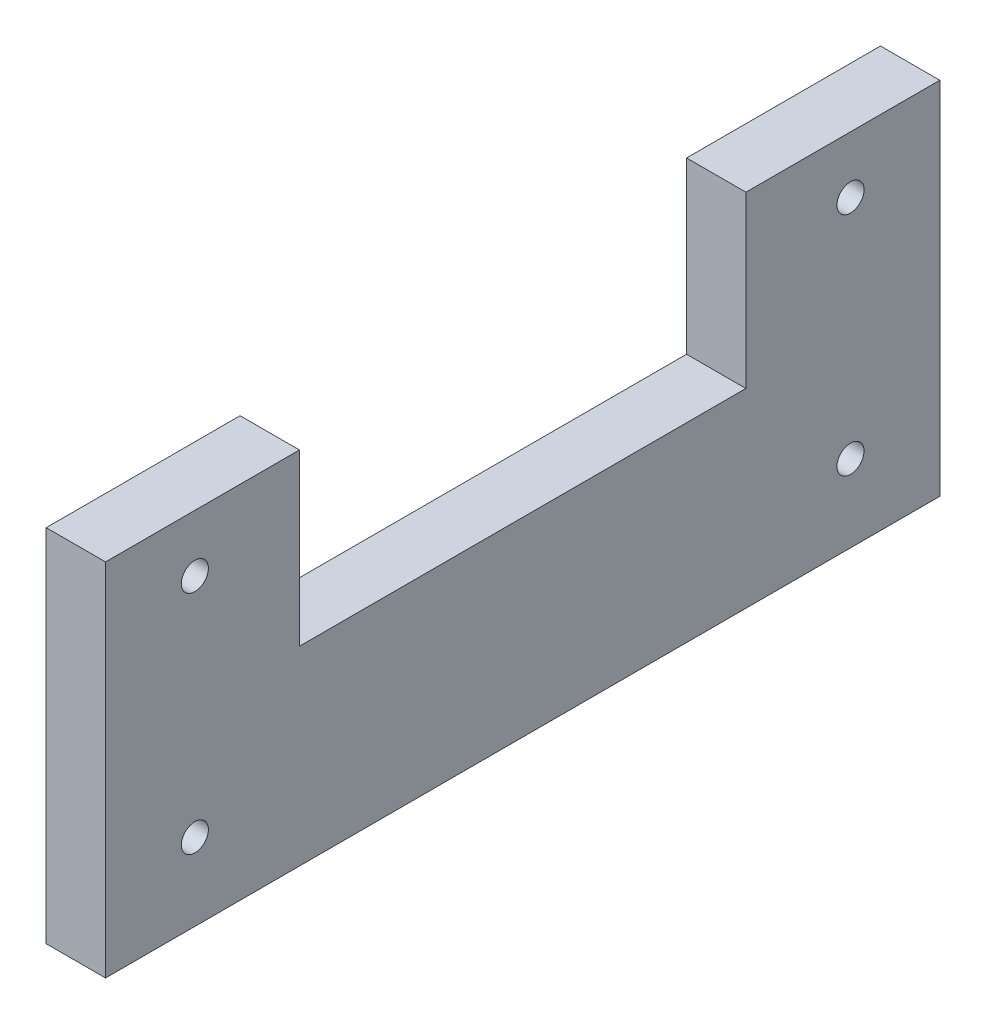
ISO-10303-21;
HEADER;
FILE_DESCRIPTION(('STEP AP214'),'2;1');
FILE_NAME('part.step','',(''),(''),'','','');
FILE_SCHEMA(('AUTOMOTIVE_DESIGN { 1 0 10303 214 1 1 1 1 }'));
ENDSEC;
DATA;
#1=APPLICATION_CONTEXT('core data for automotive mechanical design processes');
#2=APPLICATION_PROTOCOL_DEFINITION('international standard','automotive_design',2000,#1);
#3=PRODUCT_CONTEXT('',#1,'mechanical');
#4=PRODUCT('Part','Part','',(#3));
#5=PRODUCT_RELATED_PRODUCT_CATEGORY('part','',(#4));
#6=PRODUCT_DEFINITION_FORMATION('','',#4);
#7=PRODUCT_DEFINITION_CONTEXT('part definition',#1,'design');
#8=PRODUCT_DEFINITION('design','',#6,#7);
#9=PRODUCT_DEFINITION_SHAPE('','',#8);
#10=(LENGTH_UNIT() NAMED_UNIT(*) SI_UNIT(.MILLI.,.METRE.));
#11=(NAMED_UNIT(*) PLANE_ANGLE_UNIT() SI_UNIT($,.RADIAN.));
#12=(NAMED_UNIT(*) SI_UNIT($,.STERADIAN.) SOLID_ANGLE_UNIT());
#13=UNCERTAINTY_MEASURE_WITH_UNIT(LENGTH_MEASURE(1.E-05),#10,'distance_accuracy_value','');
#14=(GEOMETRIC_REPRESENTATION_CONTEXT(3) GLOBAL_UNCERTAINTY_ASSIGNED_CONTEXT((#13)) GLOBAL_UNIT_ASSIGNED_CONTEXT((#10,
#11,#12)) REPRESENTATION_CONTEXT('',''));
#15=CARTESIAN_POINT('',(0.,0.,0.));
#16=DIRECTION('',(0.,0.,1.));
#17=DIRECTION('',(1.,0.,0.));
#18=AXIS2_PLACEMENT_3D('',#15,#16,#17);
#19=CARTESIAN_POINT('',(12.7,0.,0.));
#20=DIRECTION('',(0.,0.,1.));
#21=DIRECTION('',(1.,0.,0.));
#22=AXIS2_PLACEMENT_3D('',#19,#20,#21);
#23=PLANE('',#22);
#24=DIRECTION('',(0.,1.,0.));
#25=VECTOR('',#24,1.);
#26=CARTESIAN_POINT('',(0.,0.,0.));
#27=LINE('',#26,#25);
#28=CARTESIAN_POINT('',(0.,-40.7541573033708,0.));
#29=VERTEX_POINT('',#28);
#30=CARTESIAN_POINT('',(0.,36.3876404494382,0.));
#31=VERTEX_POINT('',#30);
#32=EDGE_CURVE('E187',#29,#31,#27,.T.);
#33=ORIENTED_EDGE('',*,*,#32,.F.);
#34=DIRECTION('',(-1.,0.,0.));
#35=VECTOR('',#34,1.);
#36=CARTESIAN_POINT('',(12.7,-40.7541573033708,0.));
#37=LINE('',#36,#35);
#38=CARTESIAN_POINT('',(12.7,-40.7541573033708,0.));
#39=VERTEX_POINT('',#38);
#40=EDGE_CURVE('E11',#39,#29,#37,.T.);
#41=ORIENTED_EDGE('',*,*,#40,.F.);
#42=DIRECTION('',(0.,1.,0.));
#43=VECTOR('',#42,1.);
#44=CARTESIAN_POINT('',(12.7,0.,0.));
#45=LINE('',#44,#43);
#46=CARTESIAN_POINT('',(12.7,36.3876404494382,0.));
#47=VERTEX_POINT('',#46);
#48=EDGE_CURVE('E122',#39,#47,#45,.T.);
#49=ORIENTED_EDGE('',*,*,#48,.T.);
#50=DIRECTION('',(-1.,0.,0.));
#51=VECTOR('',#50,1.);
#52=CARTESIAN_POINT('',(12.7,36.3876404494382,0.));
#53=LINE('',#52,#51);
#54=EDGE_CURVE('E63',#47,#31,#53,.T.);
#55=ORIENTED_EDGE('',*,*,#54,.T.);
#56=EDGE_LOOP('',(#33,#41,#49,#55));
#57=FACE_BOUND('',#56,.T.);
#58=ADVANCED_FACE('F46',(#57),#23,.T.);
#59=CARTESIAN_POINT('',(12.7,-40.7541573033708,0.));
#60=DIRECTION('',(0.,1.,0.));
#61=DIRECTION('',(0.,0.,1.));
#62=AXIS2_PLACEMENT_3D('',#59,#60,#61);
#63=PLANE('',#62);
#64=DIRECTION('',(0.,0.,-1.));
#65=VECTOR('',#64,1.);
#66=CARTESIAN_POINT('',(0.,-40.7541573033708,0.));
#67=LINE('',#66,#65);
#68=CARTESIAN_POINT('',(0.,-40.7541573033708,-178.592882620654));
#69=VERTEX_POINT('',#68);
#70=EDGE_CURVE('E131',#29,#69,#67,.T.);
#71=ORIENTED_EDGE('',*,*,#70,.T.);
#72=DIRECTION('',(-1.,0.,0.));
#73=VECTOR('',#72,1.);
#74=CARTESIAN_POINT('',(12.7,-40.7541573033708,-178.592882620654));
#75=LINE('',#74,#73);
#76=CARTESIAN_POINT('',(12.7,-40.7541573033708,-178.592882620654));
#77=VERTEX_POINT('',#76);
#78=EDGE_CURVE('E128',#77,#69,#75,.T.);
#79=ORIENTED_EDGE('',*,*,#78,.F.);
#80=DIRECTION('',(0.,0.,-1.));
#81=VECTOR('',#80,1.);
#82=CARTESIAN_POINT('',(12.7,-40.7541573033708,0.));
#83=LINE('',#82,#81);
#84=EDGE_CURVE('E114',#39,#77,#83,.T.);
#85=ORIENTED_EDGE('',*,*,#84,.F.);
#86=ORIENTED_EDGE('',*,*,#40,.T.);
#87=EDGE_LOOP('',(#71,#79,#85,#86));
#88=FACE_BOUND('',#87,.T.);
#89=ADVANCED_FACE('F129',(#88),#63,.F.);
#90=CARTESIAN_POINT('',(12.7,0.,0.));
#91=DIRECTION('',(0.,1.,0.));
#92=DIRECTION('',(0.,0.,1.));
#93=AXIS2_PLACEMENT_3D('',#90,#91,#92);
#94=PLANE('',#93);
#95=DIRECTION('',(0.,0.,-1.));
#96=VECTOR('',#95,1.);
#97=CARTESIAN_POINT('',(0.,0.,0.));
#98=LINE('',#97,#96);
#99=CARTESIAN_POINT('',(0.,0.,-41.5073401867315));
#100=VERTEX_POINT('',#99);
#101=CARTESIAN_POINT('',(0.,0.,-137.085542433923));
#102=VERTEX_POINT('',#101);
#103=EDGE_CURVE('E206',#100,#102,#98,.T.);
#104=ORIENTED_EDGE('',*,*,#103,.F.);
#105=DIRECTION('',(-1.,0.,0.));
#106=VECTOR('',#105,1.);
#107=CARTESIAN_POINT('',(12.7,0.,-41.5073401867315));
#108=LINE('',#107,#106);
#109=CARTESIAN_POINT('',(12.7,0.,-41.5073401867315));
#110=VERTEX_POINT('',#109);
#111=EDGE_CURVE('E55',#110,#100,#108,.T.);
#112=ORIENTED_EDGE('',*,*,#111,.F.);
#113=DIRECTION('',(0.,0.,-1.));
#114=VECTOR('',#113,1.);
#115=CARTESIAN_POINT('',(12.7,0.,0.));
#116=LINE('',#115,#114);
#117=CARTESIAN_POINT('',(12.7,0.,-137.085542433923));
#118=VERTEX_POINT('',#117);
#119=EDGE_CURVE('E125',#110,#118,#116,.T.);
#120=ORIENTED_EDGE('',*,*,#119,.T.);
#121=DIRECTION('',(-1.,0.,0.));
#122=VECTOR('',#121,1.);
#123=CARTESIAN_POINT('',(12.7,0.,-137.085542433923));
#124=LINE('',#123,#122);
#125=EDGE_CURVE('E137',#118,#102,#124,.T.);
#126=ORIENTED_EDGE('',*,*,#125,.T.);
#127=EDGE_LOOP('',(#104,#112,#120,#126));
#128=FACE_BOUND('',#127,.T.);
#129=ADVANCED_FACE('F230',(#128),#94,.T.);
#130=CARTESIAN_POINT('',(12.7,0.,-41.5073401867315));
#131=DIRECTION('',(0.,0.,1.));
#132=DIRECTION('',(1.,0.,0.));
#133=AXIS2_PLACEMENT_3D('',#130,#131,#132);
#134=PLANE('',#133);
#135=DIRECTION('',(0.,1.,0.));
#136=VECTOR('',#135,1.);
#137=CARTESIAN_POINT('',(0.,0.,-41.5073401867315));
#138=LINE('',#137,#136);
#139=CARTESIAN_POINT('',(0.,36.3876404494382,-41.5073401867315));
#140=VERTEX_POINT('',#139);
#141=EDGE_CURVE('E209',#100,#140,#138,.T.);
#142=ORIENTED_EDGE('',*,*,#141,.T.);
#143=DIRECTION('',(-1.,0.,0.));
#144=VECTOR('',#143,1.);
#145=CARTESIAN_POINT('',(12.7,36.3876404494382,-41.5073401867315));
#146=LINE('',#145,#144);
#147=CARTESIAN_POINT('',(12.7,36.3876404494382,-41.5073401867315));
#148=VERTEX_POINT('',#147);
#149=EDGE_CURVE('E78',#148,#140,#146,.T.);
#150=ORIENTED_EDGE('',*,*,#149,.F.);
#151=DIRECTION('',(0.,1.,0.));
#152=VECTOR('',#151,1.);
#153=CARTESIAN_POINT('',(12.7,0.,-41.5073401867315));
#154=LINE('',#153,#152);
#155=EDGE_CURVE('E196',#110,#148,#154,.T.);
#156=ORIENTED_EDGE('',*,*,#155,.F.);
#157=ORIENTED_EDGE('',*,*,#111,.T.);
#158=EDGE_LOOP('',(#142,#150,#156,#157));
#159=FACE_BOUND('',#158,.T.);
#160=ADVANCED_FACE('F222',(#159),#134,.F.);
#161=CARTESIAN_POINT('',(12.7,36.3876404494382,0.));
#162=DIRECTION('',(0.,1.,0.));
#163=DIRECTION('',(0.,0.,1.));
#164=AXIS2_PLACEMENT_3D('',#161,#162,#163);
#165=PLANE('',#164);
#166=DIRECTION('',(0.,0.,-1.));
#167=VECTOR('',#166,1.);
#168=CARTESIAN_POINT('',(0.,36.3876404494382,0.));
#169=LINE('',#168,#167);
#170=EDGE_CURVE('E192',#31,#140,#169,.T.);
#171=ORIENTED_EDGE('',*,*,#170,.F.);
#172=ORIENTED_EDGE('',*,*,#54,.F.);
#173=DIRECTION('',(0.,0.,-1.));
#174=VECTOR('',#173,1.);
#175=CARTESIAN_POINT('',(12.7,36.3876404494382,0.));
#176=LINE('',#175,#174);
#177=EDGE_CURVE('E199',#47,#148,#176,.T.);
#178=ORIENTED_EDGE('',*,*,#177,.T.);
#179=ORIENTED_EDGE('',*,*,#149,.T.);
#180=EDGE_LOOP('',(#171,#172,#178,#179));
#181=FACE_BOUND('',#180,.T.);
#182=ADVANCED_FACE('F238',(#181),#165,.T.);
#183=CARTESIAN_POINT('',(12.7,0.,0.));
#184=DIRECTION('',(1.,0.,0.));
#185=DIRECTION('',(0.,0.,-1.));
#186=AXIS2_PLACEMENT_3D('',#183,#184,#185);
#187=PLANE('',#186);
#188=CARTESIAN_POINT('',(12.7,-24.2250466439423,-19.1201924199519));
#189=DIRECTION('',(-1.,0.,0.));
#190=DIRECTION('',(0.,0.,-1.));
#191=AXIS2_PLACEMENT_3D('',#188,#189,#190);
#192=CIRCLE('',#191,2.89973545876643);
#193=CARTESIAN_POINT('',(12.7,-24.2250466439423,-22.0199278787183));
#194=VERTEX_POINT('',#193);
#195=EDGE_CURVE('E136',#194,#194,#192,.T.);
#196=ORIENTED_EDGE('',*,*,#195,.T.);
#197=EDGE_LOOP('',(#196));
#198=FACE_BOUND('',#197,.T.);
#199=CARTESIAN_POINT('',(12.7,24.2250466439423,-19.1201924199519));
#200=DIRECTION('',(1.,0.,0.));
#201=DIRECTION('',(0.,0.,-1.));
#202=AXIS2_PLACEMENT_3D('',#199,#200,#201);
#203=CIRCLE('',#202,2.89973545876643);
#204=CARTESIAN_POINT('',(12.7,24.2250466439423,-22.0199278787183));
#205=VERTEX_POINT('',#204);
#206=EDGE_CURVE('E179',#205,#205,#203,.T.);
#207=ORIENTED_EDGE('',*,*,#206,.F.);
#208=EDGE_LOOP('',(#207));
#209=FACE_BOUND('',#208,.T.);
#210=ORIENTED_EDGE('',*,*,#48,.F.);
#211=ORIENTED_EDGE('',*,*,#84,.T.);
#212=DIRECTION('',(0.,1.,0.));
#213=VECTOR('',#212,1.);
#214=CARTESIAN_POINT('',(12.7,0.,-178.592882620654));
#215=LINE('',#214,#213);
#216=CARTESIAN_POINT('',(12.7,36.3876404494382,-178.592882620654));
#217=VERTEX_POINT('',#216);
#218=EDGE_CURVE('E119',#77,#217,#215,.T.);
#219=ORIENTED_EDGE('',*,*,#218,.T.);
#220=DIRECTION('',(0.,0.,1.));
#221=VECTOR('',#220,1.);
#222=CARTESIAN_POINT('',(12.7,36.3876404494382,-178.592882620654));
#223=LINE('',#222,#221);
#224=CARTESIAN_POINT('',(12.7,36.3876404494382,-137.085542433923));
#225=VERTEX_POINT('',#224);
#226=EDGE_CURVE('E149',#217,#225,#223,.T.);
#227=ORIENTED_EDGE('',*,*,#226,.T.);
#228=DIRECTION('',(0.,1.,0.));
#229=VECTOR('',#228,1.);
#230=CARTESIAN_POINT('',(12.7,0.,-137.085542433923));
#231=LINE('',#230,#229);
#232=EDGE_CURVE('E143',#118,#225,#231,.T.);
#233=ORIENTED_EDGE('',*,*,#232,.F.);
#234=ORIENTED_EDGE('',*,*,#119,.F.);
#235=ORIENTED_EDGE('',*,*,#155,.T.);
#236=ORIENTED_EDGE('',*,*,#177,.F.);
#237=EDGE_LOOP('',(#210,#211,#219,#227,#233,#234,#235,#236));
#238=FACE_BOUND('',#237,.T.);
#239=CARTESIAN_POINT('',(12.7,-24.2250466439423,-159.472690200702));
#240=DIRECTION('',(1.,0.,0.));
#241=DIRECTION('',(0.,0.,1.));
#242=AXIS2_PLACEMENT_3D('',#239,#240,#241);
#243=CIRCLE('',#242,2.89973545876643);
#244=CARTESIAN_POINT('',(12.7,-24.2250466439423,-156.572954741936));
#245=VERTEX_POINT('',#244);
#246=EDGE_CURVE('E457',#245,#245,#243,.T.);
#247=ORIENTED_EDGE('',*,*,#246,.F.);
#248=EDGE_LOOP('',(#247));
#249=FACE_BOUND('',#248,.T.);
#250=CARTESIAN_POINT('',(12.7,24.2250466439423,-159.472690200702));
#251=DIRECTION('',(-1.,0.,0.));
#252=DIRECTION('',(0.,0.,1.));
#253=AXIS2_PLACEMENT_3D('',#250,#251,#252);
#254=CIRCLE('',#253,2.89973545876643);
#255=CARTESIAN_POINT('',(12.7,24.2250466439423,-156.572954741936));
#256=VERTEX_POINT('',#255);
#257=EDGE_CURVE('E154',#256,#256,#254,.T.);
#258=ORIENTED_EDGE('',*,*,#257,.T.);
#259=EDGE_LOOP('',(#258));
#260=FACE_BOUND('',#259,.T.);
#261=ADVANCED_FACE('F116',(#198,#209,#238,#249,#260),#187,.T.);
#262=CARTESIAN_POINT('',(0.,0.,0.));
#263=DIRECTION('',(1.,0.,0.));
#264=DIRECTION('',(0.,0.,-1.));
#265=AXIS2_PLACEMENT_3D('',#262,#263,#264);
#266=PLANE('',#265);
#267=CARTESIAN_POINT('',(0.,-24.2250466439423,-19.1201924199519));
#268=DIRECTION('',(-1.,0.,0.));
#269=DIRECTION('',(0.,0.,-1.));
#270=AXIS2_PLACEMENT_3D('',#267,#268,#269);
#271=CIRCLE('',#270,2.89973545876643);
#272=CARTESIAN_POINT('',(0.,-24.2250466439423,-22.0199278787183));
#273=VERTEX_POINT('',#272);
#274=EDGE_CURVE('E175',#273,#273,#271,.T.);
#275=ORIENTED_EDGE('',*,*,#274,.F.);
#276=EDGE_LOOP('',(#275));
#277=FACE_BOUND('',#276,.T.);
#278=CARTESIAN_POINT('',(0.,24.2250466439423,-19.1201924199519));
#279=DIRECTION('',(1.,0.,0.));
#280=DIRECTION('',(0.,0.,-1.));
#281=AXIS2_PLACEMENT_3D('',#278,#279,#280);
#282=CIRCLE('',#281,2.89973545876643);
#283=CARTESIAN_POINT('',(0.,24.2250466439423,-22.0199278787183));
#284=VERTEX_POINT('',#283);
#285=EDGE_CURVE('E183',#284,#284,#282,.T.);
#286=ORIENTED_EDGE('',*,*,#285,.T.);
#287=EDGE_LOOP('',(#286));
#288=FACE_BOUND('',#287,.T.);
#289=ORIENTED_EDGE('',*,*,#32,.T.);
#290=ORIENTED_EDGE('',*,*,#170,.T.);
#291=ORIENTED_EDGE('',*,*,#141,.F.);
#292=ORIENTED_EDGE('',*,*,#103,.T.);
#293=DIRECTION('',(0.,1.,0.));
#294=VECTOR('',#293,1.);
#295=CARTESIAN_POINT('',(0.,0.,-137.085542433923));
#296=LINE('',#295,#294);
#297=CARTESIAN_POINT('',(0.,36.3876404494382,-137.085542433923));
#298=VERTEX_POINT('',#297);
#299=EDGE_CURVE('E151',#102,#298,#296,.T.);
#300=ORIENTED_EDGE('',*,*,#299,.T.);
#301=DIRECTION('',(0.,0.,1.));
#302=VECTOR('',#301,1.);
#303=CARTESIAN_POINT('',(0.,36.3876404494382,-178.592882620654));
#304=LINE('',#303,#302);
#305=CARTESIAN_POINT('',(0.,36.3876404494382,-178.592882620654));
#306=VERTEX_POINT('',#305);
#307=EDGE_CURVE('E144',#306,#298,#304,.T.);
#308=ORIENTED_EDGE('',*,*,#307,.F.);
#309=DIRECTION('',(0.,1.,0.));
#310=VECTOR('',#309,1.);
#311=CARTESIAN_POINT('',(0.,0.,-178.592882620654));
#312=LINE('',#311,#310);
#313=EDGE_CURVE('E159',#69,#306,#312,.T.);
#314=ORIENTED_EDGE('',*,*,#313,.F.);
#315=ORIENTED_EDGE('',*,*,#70,.F.);
#316=EDGE_LOOP('',(#289,#290,#291,#292,#300,#308,#314,#315));
#317=FACE_BOUND('',#316,.T.);
#318=CARTESIAN_POINT('',(0.,-24.2250466439423,-159.472690200702));
#319=DIRECTION('',(1.,0.,0.));
#320=DIRECTION('',(0.,0.,1.));
#321=AXIS2_PLACEMENT_3D('',#318,#319,#320);
#322=CIRCLE('',#321,2.89973545876643);
#323=CARTESIAN_POINT('',(0.,-24.2250466439423,-156.572954741936));
#324=VERTEX_POINT('',#323);
#325=EDGE_CURVE('E454',#324,#324,#322,.T.);
#326=ORIENTED_EDGE('',*,*,#325,.T.);
#327=EDGE_LOOP('',(#326));
#328=FACE_BOUND('',#327,.T.);
#329=CARTESIAN_POINT('',(0.,24.2250466439423,-159.472690200702));
#330=DIRECTION('',(-1.,0.,0.));
#331=DIRECTION('',(0.,0.,1.));
#332=AXIS2_PLACEMENT_3D('',#329,#330,#331);
#333=CIRCLE('',#332,2.89973545876643);
#334=CARTESIAN_POINT('',(0.,24.2250466439423,-156.572954741936));
#335=VERTEX_POINT('',#334);
#336=EDGE_CURVE('E162',#335,#335,#333,.T.);
#337=ORIENTED_EDGE('',*,*,#336,.F.);
#338=EDGE_LOOP('',(#337));
#339=FACE_BOUND('',#338,.T.);
#340=ADVANCED_FACE('F227',(#277,#288,#317,#328,#339),#266,.F.);
#341=CARTESIAN_POINT('',(0.,24.2250466439423,-19.1201924199519));
#342=DIRECTION('',(1.,0.,0.));
#343=DIRECTION('',(0.,0.,-1.));
#344=AXIS2_PLACEMENT_3D('',#341,#342,#343);
#345=CYLINDRICAL_SURFACE('',#344,2.89973545876643);
#346=ORIENTED_EDGE('',*,*,#285,.F.);
#347=EDGE_LOOP('',(#346));
#348=FACE_BOUND('',#347,.T.);
#349=ORIENTED_EDGE('',*,*,#206,.T.);
#350=EDGE_LOOP('',(#349));
#351=FACE_BOUND('',#350,.T.);
#352=ADVANCED_FACE('F284',(#348,#351),#345,.F.);
#353=CARTESIAN_POINT('',(0.,-24.2250466439423,-19.1201924199519));
#354=DIRECTION('',(1.,0.,0.));
#355=DIRECTION('',(0.,0.,-1.));
#356=AXIS2_PLACEMENT_3D('',#353,#354,#355);
#357=CYLINDRICAL_SURFACE('',#356,2.89973545876643);
#358=ORIENTED_EDGE('',*,*,#274,.T.);
#359=EDGE_LOOP('',(#358));
#360=FACE_BOUND('',#359,.T.);
#361=ORIENTED_EDGE('',*,*,#195,.F.);
#362=EDGE_LOOP('',(#361));
#363=FACE_BOUND('',#362,.T.);
#364=ADVANCED_FACE('F294',(#360,#363),#357,.F.);
#365=CARTESIAN_POINT('',(12.7,0.,-178.592882620654));
#366=DIRECTION('',(0.,0.,-1.));
#367=DIRECTION('',(1.,0.,0.));
#368=AXIS2_PLACEMENT_3D('',#365,#366,#367);
#369=PLANE('',#368);
#370=ORIENTED_EDGE('',*,*,#313,.T.);
#371=DIRECTION('',(-1.,0.,0.));
#372=VECTOR('',#371,1.);
#373=CARTESIAN_POINT('',(12.7,36.3876404494382,-178.592882620654));
#374=LINE('',#373,#372);
#375=EDGE_CURVE('E141',#217,#306,#374,.T.);
#376=ORIENTED_EDGE('',*,*,#375,.F.);
#377=ORIENTED_EDGE('',*,*,#218,.F.);
#378=ORIENTED_EDGE('',*,*,#78,.T.);
#379=EDGE_LOOP('',(#370,#376,#377,#378));
#380=FACE_BOUND('',#379,.T.);
#381=ADVANCED_FACE('F139',(#380),#369,.T.);
#382=CARTESIAN_POINT('',(12.7,0.,-137.085542433923));
#383=DIRECTION('',(0.,0.,-1.));
#384=DIRECTION('',(1.,0.,0.));
#385=AXIS2_PLACEMENT_3D('',#382,#383,#384);
#386=PLANE('',#385);
#387=ORIENTED_EDGE('',*,*,#299,.F.);
#388=ORIENTED_EDGE('',*,*,#125,.F.);
#389=ORIENTED_EDGE('',*,*,#232,.T.);
#390=DIRECTION('',(-1.,0.,0.));
#391=VECTOR('',#390,1.);
#392=CARTESIAN_POINT('',(12.7,36.3876404494382,-137.085542433923));
#393=LINE('',#392,#391);
#394=EDGE_CURVE('E168',#225,#298,#393,.T.);
#395=ORIENTED_EDGE('',*,*,#394,.T.);
#396=EDGE_LOOP('',(#387,#388,#389,#395));
#397=FACE_BOUND('',#396,.T.);
#398=ADVANCED_FACE('F234',(#397),#386,.F.);
#399=CARTESIAN_POINT('',(12.7,36.3876404494382,-178.592882620654));
#400=DIRECTION('',(0.,1.,0.));
#401=DIRECTION('',(0.,0.,-1.));
#402=AXIS2_PLACEMENT_3D('',#399,#400,#401);
#403=PLANE('',#402);
#404=ORIENTED_EDGE('',*,*,#307,.T.);
#405=ORIENTED_EDGE('',*,*,#394,.F.);
#406=ORIENTED_EDGE('',*,*,#226,.F.);
#407=ORIENTED_EDGE('',*,*,#375,.T.);
#408=EDGE_LOOP('',(#404,#405,#406,#407));
#409=FACE_BOUND('',#408,.T.);
#410=ADVANCED_FACE('F237',(#409),#403,.T.);
#411=CARTESIAN_POINT('',(0.,24.2250466439423,-159.472690200702));
#412=DIRECTION('',(1.,0.,0.));
#413=DIRECTION('',(0.,0.,1.));
#414=AXIS2_PLACEMENT_3D('',#411,#412,#413);
#415=CYLINDRICAL_SURFACE('',#414,2.89973545876643);
#416=ORIENTED_EDGE('',*,*,#336,.T.);
#417=EDGE_LOOP('',(#416));
#418=FACE_BOUND('',#417,.T.);
#419=ORIENTED_EDGE('',*,*,#257,.F.);
#420=EDGE_LOOP('',(#419));
#421=FACE_BOUND('',#420,.T.);
#422=ADVANCED_FACE('F331',(#418,#421),#415,.F.);
#423=CARTESIAN_POINT('',(0.,-24.2250466439423,-159.472690200702));
#424=DIRECTION('',(1.,0.,0.));
#425=DIRECTION('',(0.,0.,1.));
#426=AXIS2_PLACEMENT_3D('',#423,#424,#425);
#427=CYLINDRICAL_SURFACE('',#426,2.89973545876643);
#428=ORIENTED_EDGE('',*,*,#325,.F.);
#429=EDGE_LOOP('',(#428));
#430=FACE_BOUND('',#429,.T.);
#431=ORIENTED_EDGE('',*,*,#246,.T.);
#432=EDGE_LOOP('',(#431));
#433=FACE_BOUND('',#432,.T.);
#434=ADVANCED_FACE('F340',(#430,#433),#427,.F.);
#435=CLOSED_SHELL('',(#58,#89,#129,#160,#182,#261,#340,#352,#364,#381,#398,#410,#422,#434));
#436=MANIFOLD_SOLID_BREP('B2',#435);
#437=ADVANCED_BREP_SHAPE_REPRESENTATION('',(#18,#436),#14);
#438=SHAPE_DEFINITION_REPRESENTATION(#9,#437);
ENDSEC;
END-ISO-10303-21;
